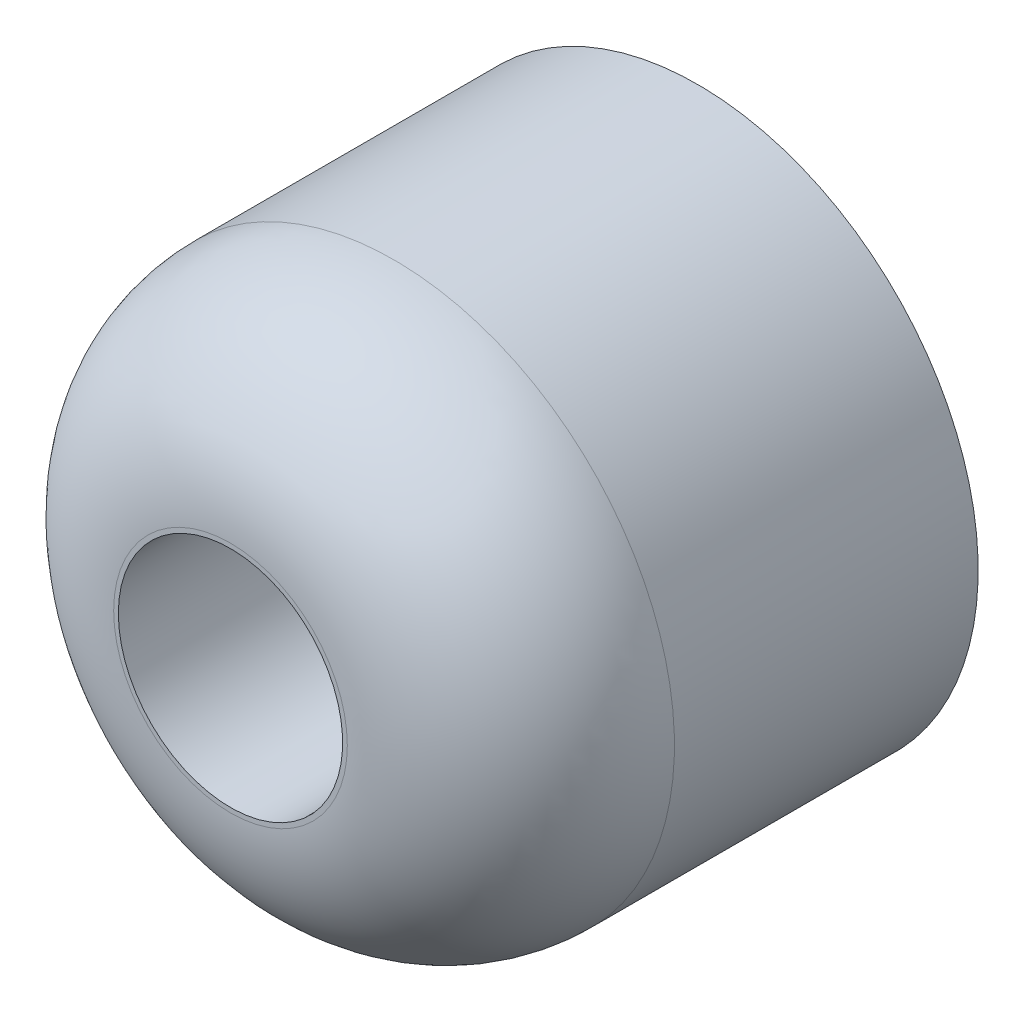
ISO-10303-21;
HEADER;
FILE_DESCRIPTION(('STEP AP214'),'2;1');
FILE_NAME('part.step','',(''),(''),'','','');
FILE_SCHEMA(('AUTOMOTIVE_DESIGN { 1 0 10303 214 1 1 1 1 }'));
ENDSEC;
DATA;
#1=APPLICATION_CONTEXT('core data for automotive mechanical design processes');
#2=APPLICATION_PROTOCOL_DEFINITION('international standard','automotive_design',2000,#1);
#3=PRODUCT_CONTEXT('',#1,'mechanical');
#4=PRODUCT('Part','Part','',(#3));
#5=PRODUCT_RELATED_PRODUCT_CATEGORY('part','',(#4));
#6=PRODUCT_DEFINITION_FORMATION('','',#4);
#7=PRODUCT_DEFINITION_CONTEXT('part definition',#1,'design');
#8=PRODUCT_DEFINITION('design','',#6,#7);
#9=PRODUCT_DEFINITION_SHAPE('','',#8);
#10=(LENGTH_UNIT() NAMED_UNIT(*) SI_UNIT(.MILLI.,.METRE.));
#11=(NAMED_UNIT(*) PLANE_ANGLE_UNIT() SI_UNIT($,.RADIAN.));
#12=(NAMED_UNIT(*) SI_UNIT($,.STERADIAN.) SOLID_ANGLE_UNIT());
#13=UNCERTAINTY_MEASURE_WITH_UNIT(LENGTH_MEASURE(1.E-05),#10,'distance_accuracy_value','');
#14=(GEOMETRIC_REPRESENTATION_CONTEXT(3) GLOBAL_UNCERTAINTY_ASSIGNED_CONTEXT((#13)) GLOBAL_UNIT_ASSIGNED_CONTEXT((#10,
#11,#12)) REPRESENTATION_CONTEXT('',''));
#15=CARTESIAN_POINT('',(0.,0.,0.));
#16=DIRECTION('',(0.,0.,1.));
#17=DIRECTION('',(1.,0.,0.));
#18=AXIS2_PLACEMENT_3D('',#15,#16,#17);
#19=CARTESIAN_POINT('',(0.,3.9,0.));
#20=DIRECTION('',(0.,0.,-1.));
#21=DIRECTION('',(-1.,0.,0.));
#22=AXIS2_PLACEMENT_3D('',#19,#20,#21);
#23=PLANE('',#22);
#24=CARTESIAN_POINT('',(0.,0.,0.));
#25=DIRECTION('',(0.,0.,-1.));
#26=DIRECTION('',(-1.,0.,0.));
#27=AXIS2_PLACEMENT_3D('',#24,#25,#26);
#28=CIRCLE('',#27,3.9);
#29=CARTESIAN_POINT('',(-3.9,0.,0.));
#30=VERTEX_POINT('',#29);
#31=EDGE_CURVE('E10',#30,#30,#28,.T.);
#32=ORIENTED_EDGE('',*,*,#31,.T.);
#33=EDGE_LOOP('',(#32));
#34=FACE_BOUND('',#33,.T.);
#35=CARTESIAN_POINT('',(0.,0.,0.));
#36=DIRECTION('',(0.,0.,-1.));
#37=DIRECTION('',(-1.,0.,0.));
#38=AXIS2_PLACEMENT_3D('',#35,#36,#37);
#39=CIRCLE('',#38,2.4);
#40=CARTESIAN_POINT('',(-2.4,0.,0.));
#41=VERTEX_POINT('',#40);
#42=EDGE_CURVE('E80',#41,#41,#39,.T.);
#43=ORIENTED_EDGE('',*,*,#42,.F.);
#44=EDGE_LOOP('',(#43));
#45=FACE_BOUND('',#44,.T.);
#46=ADVANCED_FACE('F41',(#34,#45),#23,.T.);
#47=CARTESIAN_POINT('',(0.,0.,0.));
#48=DIRECTION('',(0.,0.,-1.));
#49=DIRECTION('',(-1.,0.,0.));
#50=AXIS2_PLACEMENT_3D('',#47,#48,#49);
#51=CYLINDRICAL_SURFACE('',#50,3.9);
#52=CARTESIAN_POINT('',(0.,0.,6.));
#53=DIRECTION('',(0.,0.,-1.));
#54=DIRECTION('',(-1.,0.,0.));
#55=AXIS2_PLACEMENT_3D('',#52,#53,#54);
#56=CIRCLE('',#55,3.9);
#57=CARTESIAN_POINT('',(-3.9,0.,6.));
#58=VERTEX_POINT('',#57);
#59=EDGE_CURVE('E48',#58,#58,#56,.T.);
#60=ORIENTED_EDGE('',*,*,#59,.T.);
#61=EDGE_LOOP('',(#60));
#62=FACE_BOUND('',#61,.T.);
#63=ORIENTED_EDGE('',*,*,#31,.F.);
#64=EDGE_LOOP('',(#63));
#65=FACE_BOUND('',#64,.T.);
#66=ADVANCED_FACE('F89',(#62,#65),#51,.T.);
#67=CARTESIAN_POINT('',(0.,5.5,6.));
#68=DIRECTION('',(0.,0.,-1.));
#69=DIRECTION('',(-1.,0.,0.));
#70=AXIS2_PLACEMENT_3D('',#67,#68,#69);
#71=PLANE('',#70);
#72=CARTESIAN_POINT('',(0.,0.,6.));
#73=DIRECTION('',(0.,0.,-1.));
#74=DIRECTION('',(-1.,0.,0.));
#75=AXIS2_PLACEMENT_3D('',#72,#73,#74);
#76=CIRCLE('',#75,5.5);
#77=CARTESIAN_POINT('',(-5.5,0.,6.));
#78=VERTEX_POINT('',#77);
#79=EDGE_CURVE('E53',#78,#78,#76,.T.);
#80=ORIENTED_EDGE('',*,*,#79,.T.);
#81=EDGE_LOOP('',(#80));
#82=FACE_BOUND('',#81,.T.);
#83=ORIENTED_EDGE('',*,*,#59,.F.);
#84=EDGE_LOOP('',(#83));
#85=FACE_BOUND('',#84,.T.);
#86=ADVANCED_FACE('F93',(#82,#85),#71,.T.);
#87=CARTESIAN_POINT('',(0.,0.,0.));
#88=DIRECTION('',(0.,0.,-1.));
#89=DIRECTION('',(-1.,0.,0.));
#90=AXIS2_PLACEMENT_3D('',#87,#88,#89);
#91=CYLINDRICAL_SURFACE('',#90,5.5);
#92=CARTESIAN_POINT('',(0.,0.,0.));
#93=DIRECTION('',(0.,0.,-1.));
#94=DIRECTION('',(-1.,0.,0.));
#95=AXIS2_PLACEMENT_3D('',#92,#93,#94);
#96=CIRCLE('',#95,5.5);
#97=CARTESIAN_POINT('',(-5.5,0.,0.));
#98=VERTEX_POINT('',#97);
#99=EDGE_CURVE('E58',#98,#98,#96,.T.);
#100=ORIENTED_EDGE('',*,*,#99,.T.);
#101=EDGE_LOOP('',(#100));
#102=FACE_BOUND('',#101,.T.);
#103=ORIENTED_EDGE('',*,*,#79,.F.);
#104=EDGE_LOOP('',(#103));
#105=FACE_BOUND('',#104,.T.);
#106=ADVANCED_FACE('F97',(#102,#105),#91,.F.);
#107=CARTESIAN_POINT('',(0.,6.,0.));
#108=DIRECTION('',(0.,0.,-1.));
#109=DIRECTION('',(-1.,0.,0.));
#110=AXIS2_PLACEMENT_3D('',#107,#108,#109);
#111=PLANE('',#110);
#112=CARTESIAN_POINT('',(0.,0.,0.));
#113=DIRECTION('',(0.,0.,-1.));
#114=DIRECTION('',(-1.,0.,0.));
#115=AXIS2_PLACEMENT_3D('',#112,#113,#114);
#116=CIRCLE('',#115,6.);
#117=CARTESIAN_POINT('',(-6.,0.,0.));
#118=VERTEX_POINT('',#117);
#119=EDGE_CURVE('E64',#118,#118,#116,.T.);
#120=ORIENTED_EDGE('',*,*,#119,.T.);
#121=EDGE_LOOP('',(#120));
#122=FACE_BOUND('',#121,.T.);
#123=ORIENTED_EDGE('',*,*,#99,.F.);
#124=EDGE_LOOP('',(#123));
#125=FACE_BOUND('',#124,.T.);
#126=ADVANCED_FACE('F104',(#122,#125),#111,.T.);
#127=CARTESIAN_POINT('',(0.,0.,0.));
#128=DIRECTION('',(0.,0.,-1.));
#129=DIRECTION('',(-1.,0.,0.));
#130=AXIS2_PLACEMENT_3D('',#127,#128,#129);
#131=CYLINDRICAL_SURFACE('',#130,6.);
#132=CARTESIAN_POINT('',(0.,0.,6.49999999999998));
#133=DIRECTION('',(0.,0.,-1.));
#134=DIRECTION('',(-1.,0.,0.));
#135=AXIS2_PLACEMENT_3D('',#132,#133,#134);
#136=CIRCLE('',#135,6.);
#137=CARTESIAN_POINT('',(-6.,0.,6.49999999999998));
#138=VERTEX_POINT('',#137);
#139=EDGE_CURVE('E68',#138,#138,#136,.T.);
#140=ORIENTED_EDGE('',*,*,#139,.T.);
#141=EDGE_LOOP('',(#140));
#142=FACE_BOUND('',#141,.T.);
#143=ORIENTED_EDGE('',*,*,#119,.F.);
#144=EDGE_LOOP('',(#143));
#145=FACE_BOUND('',#144,.T.);
#146=ADVANCED_FACE('F108',(#142,#145),#131,.T.);
#147=CARTESIAN_POINT('',(0.,0.,6.5));
#148=DIRECTION('',(0.,0.,-1.));
#149=DIRECTION('',(-1.,0.,0.));
#150=AXIS2_PLACEMENT_3D('',#147,#148,#149);
#151=DEGENERATE_TOROIDAL_SURFACE('',#150,2.5,3.5,.T.);
#152=CARTESIAN_POINT('',(0.,0.,10.));
#153=DIRECTION('',(0.,0.,-1.));
#154=DIRECTION('',(-1.,0.,0.));
#155=AXIS2_PLACEMENT_3D('',#152,#153,#154);
#156=CIRCLE('',#155,2.49999999999997);
#157=CARTESIAN_POINT('',(-2.49999999999997,0.,10.));
#158=VERTEX_POINT('',#157);
#159=EDGE_CURVE('E72',#158,#158,#156,.T.);
#160=ORIENTED_EDGE('',*,*,#159,.T.);
#161=EDGE_LOOP('',(#160));
#162=FACE_BOUND('',#161,.T.);
#163=ORIENTED_EDGE('',*,*,#139,.F.);
#164=EDGE_LOOP('',(#163));
#165=FACE_BOUND('',#164,.T.);
#166=ADVANCED_FACE('F112',(#162,#165),#151,.T.);
#167=CARTESIAN_POINT('',(0.,2.4,10.));
#168=DIRECTION('',(0.,0.,1.));
#169=DIRECTION('',(1.,0.,0.));
#170=AXIS2_PLACEMENT_3D('',#167,#168,#169);
#171=PLANE('',#170);
#172=CARTESIAN_POINT('',(0.,0.,10.));
#173=DIRECTION('',(0.,0.,-1.));
#174=DIRECTION('',(-1.,0.,0.));
#175=AXIS2_PLACEMENT_3D('',#172,#173,#174);
#176=CIRCLE('',#175,2.4);
#177=CARTESIAN_POINT('',(-2.4,0.,10.));
#178=VERTEX_POINT('',#177);
#179=EDGE_CURVE('E76',#178,#178,#176,.T.);
#180=ORIENTED_EDGE('',*,*,#179,.T.);
#181=EDGE_LOOP('',(#180));
#182=FACE_BOUND('',#181,.T.);
#183=ORIENTED_EDGE('',*,*,#159,.F.);
#184=EDGE_LOOP('',(#183));
#185=FACE_BOUND('',#184,.T.);
#186=ADVANCED_FACE('F116',(#182,#185),#171,.T.);
#187=CARTESIAN_POINT('',(0.,0.,0.));
#188=DIRECTION('',(0.,0.,-1.));
#189=DIRECTION('',(-1.,0.,0.));
#190=AXIS2_PLACEMENT_3D('',#187,#188,#189);
#191=CYLINDRICAL_SURFACE('',#190,2.4);
#192=ORIENTED_EDGE('',*,*,#42,.T.);
#193=EDGE_LOOP('',(#192));
#194=FACE_BOUND('',#193,.T.);
#195=ORIENTED_EDGE('',*,*,#179,.F.);
#196=EDGE_LOOP('',(#195));
#197=FACE_BOUND('',#196,.T.);
#198=ADVANCED_FACE('F85',(#194,#197),#191,.F.);
#199=CLOSED_SHELL('',(#46,#66,#86,#106,#126,#146,#166,#186,#198));
#200=MANIFOLD_SOLID_BREP('B2',#199);
#201=ADVANCED_BREP_SHAPE_REPRESENTATION('',(#18,#200),#14);
#202=SHAPE_DEFINITION_REPRESENTATION(#9,#201);
ENDSEC;
END-ISO-10303-21;
